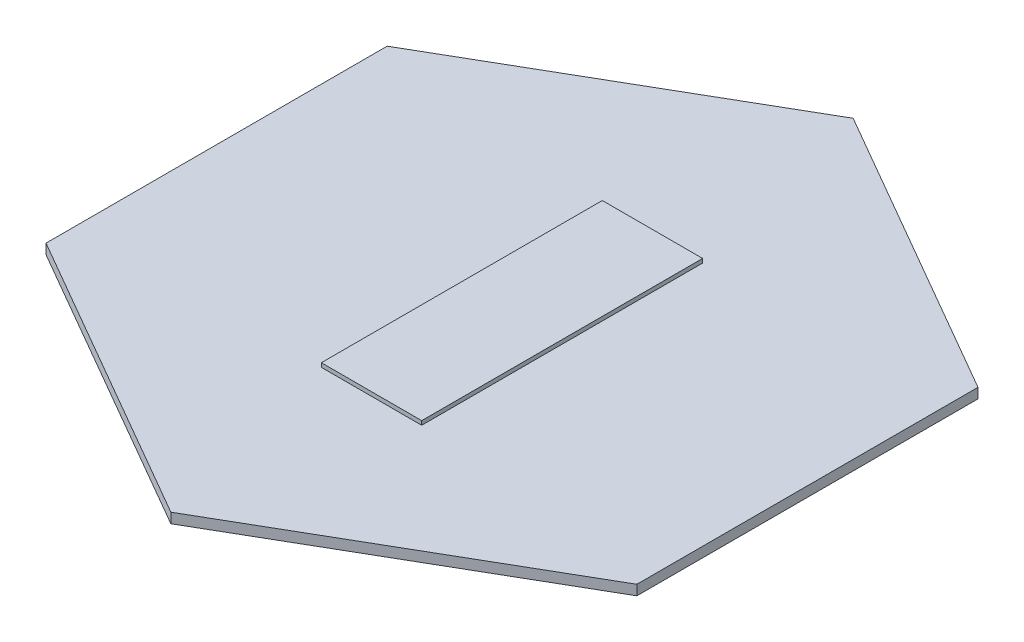
ISO-10303-21;
HEADER;
FILE_DESCRIPTION(('STEP AP214'),'2;1');
FILE_NAME('part.step','',(''),(''),'','','');
FILE_SCHEMA(('AUTOMOTIVE_DESIGN { 1 0 10303 214 1 1 1 1 }'));
ENDSEC;
DATA;
#1=APPLICATION_CONTEXT('core data for automotive mechanical design processes');
#2=APPLICATION_PROTOCOL_DEFINITION('international standard','automotive_design',2000,#1);
#3=PRODUCT_CONTEXT('',#1,'mechanical');
#4=PRODUCT('Part','Part','',(#3));
#5=PRODUCT_RELATED_PRODUCT_CATEGORY('part','',(#4));
#6=PRODUCT_DEFINITION_FORMATION('','',#4);
#7=PRODUCT_DEFINITION_CONTEXT('part definition',#1,'design');
#8=PRODUCT_DEFINITION('design','',#6,#7);
#9=PRODUCT_DEFINITION_SHAPE('','',#8);
#10=(LENGTH_UNIT() NAMED_UNIT(*) SI_UNIT(.MILLI.,.METRE.));
#11=(NAMED_UNIT(*) PLANE_ANGLE_UNIT() SI_UNIT($,.RADIAN.));
#12=(NAMED_UNIT(*) SI_UNIT($,.STERADIAN.) SOLID_ANGLE_UNIT());
#13=UNCERTAINTY_MEASURE_WITH_UNIT(LENGTH_MEASURE(1.E-05),#10,'distance_accuracy_value','');
#14=(GEOMETRIC_REPRESENTATION_CONTEXT(3) GLOBAL_UNCERTAINTY_ASSIGNED_CONTEXT((#13)) GLOBAL_UNIT_ASSIGNED_CONTEXT((#10,
#11,#12)) REPRESENTATION_CONTEXT('',''));
#15=CARTESIAN_POINT('',(0.,0.,0.));
#16=DIRECTION('',(0.,0.,1.));
#17=DIRECTION('',(1.,0.,0.));
#18=AXIS2_PLACEMENT_3D('',#15,#16,#17);
#19=CARTESIAN_POINT('',(0.,2.5,0.));
#20=DIRECTION('',(0.,1.,0.));
#21=DIRECTION('',(0.,0.,1.));
#22=AXIS2_PLACEMENT_3D('',#19,#20,#21);
#23=PLANE('',#22);
#24=DIRECTION('',(0.,0.,-1.));
#25=VECTOR('',#24,1.);
#26=CARTESIAN_POINT('',(73.6121593216773,2.5,42.5));
#27=LINE('',#26,#25);
#28=CARTESIAN_POINT('',(73.6121593216773,2.5,42.5));
#29=VERTEX_POINT('',#28);
#30=CARTESIAN_POINT('',(73.6121593216773,2.5,-42.5));
#31=VERTEX_POINT('',#30);
#32=EDGE_CURVE('E142',#29,#31,#27,.T.);
#33=ORIENTED_EDGE('',*,*,#32,.T.);
#34=DIRECTION('',(-0.866025403784439,0.,-0.5));
#35=VECTOR('',#34,1.);
#36=CARTESIAN_POINT('',(73.6121593216773,2.5,-42.5));
#37=LINE('',#36,#35);
#38=CARTESIAN_POINT('',(0.,2.5,-85.));
#39=VERTEX_POINT('',#38);
#40=EDGE_CURVE('E92',#31,#39,#37,.T.);
#41=ORIENTED_EDGE('',*,*,#40,.T.);
#42=DIRECTION('',(-0.866025403784438,0.,0.500000000000001));
#43=VECTOR('',#42,1.);
#44=CARTESIAN_POINT('',(0.,2.5,-85.));
#45=LINE('',#44,#43);
#46=CARTESIAN_POINT('',(-73.6121593216772,2.5,-42.5));
#47=VERTEX_POINT('',#46);
#48=EDGE_CURVE('E109',#39,#47,#45,.T.);
#49=ORIENTED_EDGE('',*,*,#48,.T.);
#50=DIRECTION('',(0.,0.,1.));
#51=VECTOR('',#50,1.);
#52=CARTESIAN_POINT('',(-73.6121593216772,2.5,-42.5));
#53=LINE('',#52,#51);
#54=CARTESIAN_POINT('',(-73.6121593216772,2.5,42.5));
#55=VERTEX_POINT('',#54);
#56=EDGE_CURVE('E102',#47,#55,#53,.T.);
#57=ORIENTED_EDGE('',*,*,#56,.T.);
#58=DIRECTION('',(0.866025403784439,0.,0.5));
#59=VECTOR('',#58,1.);
#60=CARTESIAN_POINT('',(-73.6121593216772,2.5,42.5));
#61=LINE('',#60,#59);
#62=CARTESIAN_POINT('',(0.,2.5,85.));
#63=VERTEX_POINT('',#62);
#64=EDGE_CURVE('E106',#55,#63,#61,.T.);
#65=ORIENTED_EDGE('',*,*,#64,.T.);
#66=DIRECTION('',(0.866025403784438,0.,-0.5));
#67=VECTOR('',#66,1.);
#68=CARTESIAN_POINT('',(0.,2.5,85.));
#69=LINE('',#68,#67);
#70=EDGE_CURVE('E57',#63,#29,#69,.T.);
#71=ORIENTED_EDGE('',*,*,#70,.T.);
#72=EDGE_LOOP('',(#33,#41,#49,#57,#65,#71));
#73=FACE_BOUND('',#72,.T.);
#74=DIRECTION('',(-1.,0.,0.));
#75=VECTOR('',#74,1.);
#76=CARTESIAN_POINT('',(-12.5,2.5,-35.));
#77=LINE('',#76,#75);
#78=CARTESIAN_POINT('',(12.5,2.5,-35.));
#79=VERTEX_POINT('',#78);
#80=CARTESIAN_POINT('',(-12.5,2.5,-35.));
#81=VERTEX_POINT('',#80);
#82=EDGE_CURVE('E174',#79,#81,#77,.T.);
#83=ORIENTED_EDGE('',*,*,#82,.F.);
#84=DIRECTION('',(0.,0.,-1.));
#85=VECTOR('',#84,1.);
#86=CARTESIAN_POINT('',(12.5,2.5,35.));
#87=LINE('',#86,#85);
#88=CARTESIAN_POINT('',(12.5,2.5,35.));
#89=VERTEX_POINT('',#88);
#90=EDGE_CURVE('E177',#89,#79,#87,.T.);
#91=ORIENTED_EDGE('',*,*,#90,.F.);
#92=DIRECTION('',(1.,0.,0.));
#93=VECTOR('',#92,1.);
#94=CARTESIAN_POINT('',(-12.5,2.5,35.));
#95=LINE('',#94,#93);
#96=CARTESIAN_POINT('',(-12.5,2.5,35.));
#97=VERTEX_POINT('',#96);
#98=EDGE_CURVE('E169',#97,#89,#95,.T.);
#99=ORIENTED_EDGE('',*,*,#98,.F.);
#100=DIRECTION('',(0.,0.,1.));
#101=VECTOR('',#100,1.);
#102=CARTESIAN_POINT('',(-12.5,2.5,35.));
#103=LINE('',#102,#101);
#104=EDGE_CURVE('E172',#81,#97,#103,.T.);
#105=ORIENTED_EDGE('',*,*,#104,.F.);
#106=EDGE_LOOP('',(#83,#91,#99,#105));
#107=FACE_BOUND('',#106,.T.);
#108=ADVANCED_FACE('F33',(#73,#107),#23,.T.);
#109=CARTESIAN_POINT('',(73.6121593216773,2.5,42.5));
#110=DIRECTION('',(-1.,0.,0.));
#111=DIRECTION('',(0.,0.,1.));
#112=AXIS2_PLACEMENT_3D('',#109,#110,#111);
#113=PLANE('',#112);
#114=DIRECTION('',(0.,0.,-1.));
#115=VECTOR('',#114,1.);
#116=CARTESIAN_POINT('',(73.6121593216773,0.,42.5));
#117=LINE('',#116,#115);
#118=CARTESIAN_POINT('',(73.6121593216773,0.,42.5));
#119=VERTEX_POINT('',#118);
#120=CARTESIAN_POINT('',(73.6121593216773,0.,-42.5));
#121=VERTEX_POINT('',#120);
#122=EDGE_CURVE('E130',#119,#121,#117,.T.);
#123=ORIENTED_EDGE('',*,*,#122,.T.);
#124=DIRECTION('',(0.,-1.,0.));
#125=VECTOR('',#124,1.);
#126=CARTESIAN_POINT('',(73.6121593216773,2.5,-42.5));
#127=LINE('',#126,#125);
#128=EDGE_CURVE('E11',#31,#121,#127,.T.);
#129=ORIENTED_EDGE('',*,*,#128,.F.);
#130=ORIENTED_EDGE('',*,*,#32,.F.);
#131=DIRECTION('',(0.,-1.,0.));
#132=VECTOR('',#131,1.);
#133=CARTESIAN_POINT('',(73.6121593216773,2.5,42.5));
#134=LINE('',#133,#132);
#135=EDGE_CURVE('E126',#29,#119,#134,.T.);
#136=ORIENTED_EDGE('',*,*,#135,.T.);
#137=EDGE_LOOP('',(#123,#129,#130,#136));
#138=FACE_BOUND('',#137,.T.);
#139=ADVANCED_FACE('F35',(#138),#113,.F.);
#140=CARTESIAN_POINT('',(73.6121593216773,2.5,-42.5));
#141=DIRECTION('',(-0.5,0.,0.866025403784439));
#142=DIRECTION('',(0.866025403784439,0.,0.5));
#143=AXIS2_PLACEMENT_3D('',#140,#141,#142);
#144=PLANE('',#143);
#145=DIRECTION('',(-0.866025403784439,0.,-0.5));
#146=VECTOR('',#145,1.);
#147=CARTESIAN_POINT('',(73.6121593216773,0.,-42.5));
#148=LINE('',#147,#146);
#149=CARTESIAN_POINT('',(0.,0.,-85.));
#150=VERTEX_POINT('',#149);
#151=EDGE_CURVE('E133',#121,#150,#148,.T.);
#152=ORIENTED_EDGE('',*,*,#151,.T.);
#153=DIRECTION('',(0.,-1.,0.));
#154=VECTOR('',#153,1.);
#155=CARTESIAN_POINT('',(0.,2.5,-85.));
#156=LINE('',#155,#154);
#157=EDGE_CURVE('E41',#39,#150,#156,.T.);
#158=ORIENTED_EDGE('',*,*,#157,.F.);
#159=ORIENTED_EDGE('',*,*,#40,.F.);
#160=ORIENTED_EDGE('',*,*,#128,.T.);
#161=EDGE_LOOP('',(#152,#158,#159,#160));
#162=FACE_BOUND('',#161,.T.);
#163=ADVANCED_FACE('F223',(#162),#144,.F.);
#164=CARTESIAN_POINT('',(0.,2.5,-85.));
#165=DIRECTION('',(0.500000000000001,0.,0.866025403784438));
#166=DIRECTION('',(0.866025403784438,0.,-0.500000000000001));
#167=AXIS2_PLACEMENT_3D('',#164,#165,#166);
#168=PLANE('',#167);
#169=DIRECTION('',(-0.866025403784438,0.,0.500000000000001));
#170=VECTOR('',#169,1.);
#171=CARTESIAN_POINT('',(0.,0.,-85.));
#172=LINE('',#171,#170);
#173=CARTESIAN_POINT('',(-73.6121593216772,0.,-42.5));
#174=VERTEX_POINT('',#173);
#175=EDGE_CURVE('E136',#150,#174,#172,.T.);
#176=ORIENTED_EDGE('',*,*,#175,.T.);
#177=DIRECTION('',(0.,-1.,0.));
#178=VECTOR('',#177,1.);
#179=CARTESIAN_POINT('',(-73.6121593216772,2.5,-42.5));
#180=LINE('',#179,#178);
#181=EDGE_CURVE('E121',#47,#174,#180,.T.);
#182=ORIENTED_EDGE('',*,*,#181,.F.);
#183=ORIENTED_EDGE('',*,*,#48,.F.);
#184=ORIENTED_EDGE('',*,*,#157,.T.);
#185=EDGE_LOOP('',(#176,#182,#183,#184));
#186=FACE_BOUND('',#185,.T.);
#187=ADVANCED_FACE('F148',(#186),#168,.F.);
#188=CARTESIAN_POINT('',(-73.6121593216772,2.5,-42.5));
#189=DIRECTION('',(1.,0.,0.));
#190=DIRECTION('',(0.,0.,-1.));
#191=AXIS2_PLACEMENT_3D('',#188,#189,#190);
#192=PLANE('',#191);
#193=DIRECTION('',(0.,0.,1.));
#194=VECTOR('',#193,1.);
#195=CARTESIAN_POINT('',(-73.6121593216772,0.,-42.5));
#196=LINE('',#195,#194);
#197=CARTESIAN_POINT('',(-73.6121593216772,0.,42.5));
#198=VERTEX_POINT('',#197);
#199=EDGE_CURVE('E118',#174,#198,#196,.T.);
#200=ORIENTED_EDGE('',*,*,#199,.T.);
#201=DIRECTION('',(0.,-1.,0.));
#202=VECTOR('',#201,1.);
#203=CARTESIAN_POINT('',(-73.6121593216772,2.5,42.5));
#204=LINE('',#203,#202);
#205=EDGE_CURVE('E115',#55,#198,#204,.T.);
#206=ORIENTED_EDGE('',*,*,#205,.F.);
#207=ORIENTED_EDGE('',*,*,#56,.F.);
#208=ORIENTED_EDGE('',*,*,#181,.T.);
#209=EDGE_LOOP('',(#200,#206,#207,#208));
#210=FACE_BOUND('',#209,.T.);
#211=ADVANCED_FACE('F116',(#210),#192,.F.);
#212=CARTESIAN_POINT('',(-73.6121593216772,2.5,42.5));
#213=DIRECTION('',(0.5,0.,-0.866025403784439));
#214=DIRECTION('',(-0.866025403784439,0.,-0.5));
#215=AXIS2_PLACEMENT_3D('',#212,#213,#214);
#216=PLANE('',#215);
#217=DIRECTION('',(0.866025403784439,0.,0.5));
#218=VECTOR('',#217,1.);
#219=CARTESIAN_POINT('',(-73.6121593216772,0.,42.5));
#220=LINE('',#219,#218);
#221=CARTESIAN_POINT('',(0.,0.,85.));
#222=VERTEX_POINT('',#221);
#223=EDGE_CURVE('E139',#198,#222,#220,.T.);
#224=ORIENTED_EDGE('',*,*,#223,.T.);
#225=DIRECTION('',(0.,-1.,0.));
#226=VECTOR('',#225,1.);
#227=CARTESIAN_POINT('',(0.,2.5,85.));
#228=LINE('',#227,#226);
#229=EDGE_CURVE('E122',#63,#222,#228,.T.);
#230=ORIENTED_EDGE('',*,*,#229,.F.);
#231=ORIENTED_EDGE('',*,*,#64,.F.);
#232=ORIENTED_EDGE('',*,*,#205,.T.);
#233=EDGE_LOOP('',(#224,#230,#231,#232));
#234=FACE_BOUND('',#233,.T.);
#235=ADVANCED_FACE('F124',(#234),#216,.F.);
#236=CARTESIAN_POINT('',(0.,2.5,85.));
#237=DIRECTION('',(-0.5,0.,-0.866025403784438));
#238=DIRECTION('',(-0.866025403784438,0.,0.5));
#239=AXIS2_PLACEMENT_3D('',#236,#237,#238);
#240=PLANE('',#239);
#241=DIRECTION('',(0.866025403784438,0.,-0.5));
#242=VECTOR('',#241,1.);
#243=CARTESIAN_POINT('',(0.,0.,85.));
#244=LINE('',#243,#242);
#245=EDGE_CURVE('E84',#222,#119,#244,.T.);
#246=ORIENTED_EDGE('',*,*,#245,.T.);
#247=ORIENTED_EDGE('',*,*,#135,.F.);
#248=ORIENTED_EDGE('',*,*,#70,.F.);
#249=ORIENTED_EDGE('',*,*,#229,.T.);
#250=EDGE_LOOP('',(#246,#247,#248,#249));
#251=FACE_BOUND('',#250,.T.);
#252=ADVANCED_FACE('F152',(#251),#240,.F.);
#253=CARTESIAN_POINT('',(0.,0.,0.));
#254=DIRECTION('',(0.,1.,0.));
#255=DIRECTION('',(0.,0.,1.));
#256=AXIS2_PLACEMENT_3D('',#253,#254,#255);
#257=PLANE('',#256);
#258=ORIENTED_EDGE('',*,*,#122,.F.);
#259=ORIENTED_EDGE('',*,*,#245,.F.);
#260=ORIENTED_EDGE('',*,*,#223,.F.);
#261=ORIENTED_EDGE('',*,*,#199,.F.);
#262=ORIENTED_EDGE('',*,*,#175,.F.);
#263=ORIENTED_EDGE('',*,*,#151,.F.);
#264=EDGE_LOOP('',(#258,#259,#260,#261,#262,#263));
#265=FACE_BOUND('',#264,.T.);
#266=ADVANCED_FACE('F151',(#265),#257,.F.);
#267=CARTESIAN_POINT('',(12.5,3.5,35.));
#268=DIRECTION('',(-1.,0.,0.));
#269=DIRECTION('',(0.,0.,1.));
#270=AXIS2_PLACEMENT_3D('',#267,#268,#269);
#271=PLANE('',#270);
#272=ORIENTED_EDGE('',*,*,#90,.T.);
#273=DIRECTION('',(0.,-1.,0.));
#274=VECTOR('',#273,1.);
#275=CARTESIAN_POINT('',(12.5,3.5,-35.));
#276=LINE('',#275,#274);
#277=CARTESIAN_POINT('',(12.5,3.5,-35.));
#278=VERTEX_POINT('',#277);
#279=EDGE_CURVE('E134',#278,#79,#276,.T.);
#280=ORIENTED_EDGE('',*,*,#279,.F.);
#281=DIRECTION('',(0.,0.,-1.));
#282=VECTOR('',#281,1.);
#283=CARTESIAN_POINT('',(12.5,3.5,35.));
#284=LINE('',#283,#282);
#285=CARTESIAN_POINT('',(12.5,3.5,35.));
#286=VERTEX_POINT('',#285);
#287=EDGE_CURVE('E171',#286,#278,#284,.T.);
#288=ORIENTED_EDGE('',*,*,#287,.F.);
#289=DIRECTION('',(0.,-1.,0.));
#290=VECTOR('',#289,1.);
#291=CARTESIAN_POINT('',(12.5,3.5,35.));
#292=LINE('',#291,#290);
#293=EDGE_CURVE('E165',#286,#89,#292,.T.);
#294=ORIENTED_EDGE('',*,*,#293,.T.);
#295=EDGE_LOOP('',(#272,#280,#288,#294));
#296=FACE_BOUND('',#295,.T.);
#297=ADVANCED_FACE('F200',(#296),#271,.F.);
#298=CARTESIAN_POINT('',(-12.5,3.5,-35.));
#299=DIRECTION('',(0.,0.,1.));
#300=DIRECTION('',(1.,0.,0.));
#301=AXIS2_PLACEMENT_3D('',#298,#299,#300);
#302=PLANE('',#301);
#303=ORIENTED_EDGE('',*,*,#82,.T.);
#304=DIRECTION('',(0.,-1.,0.));
#305=VECTOR('',#304,1.);
#306=CARTESIAN_POINT('',(-12.5,3.5,-35.));
#307=LINE('',#306,#305);
#308=CARTESIAN_POINT('',(-12.5,3.5,-35.));
#309=VERTEX_POINT('',#308);
#310=EDGE_CURVE('E161',#309,#81,#307,.T.);
#311=ORIENTED_EDGE('',*,*,#310,.F.);
#312=DIRECTION('',(-1.,0.,0.));
#313=VECTOR('',#312,1.);
#314=CARTESIAN_POINT('',(-12.5,3.5,-35.));
#315=LINE('',#314,#313);
#316=EDGE_CURVE('E185',#278,#309,#315,.T.);
#317=ORIENTED_EDGE('',*,*,#316,.F.);
#318=ORIENTED_EDGE('',*,*,#279,.T.);
#319=EDGE_LOOP('',(#303,#311,#317,#318));
#320=FACE_BOUND('',#319,.T.);
#321=ADVANCED_FACE('F205',(#320),#302,.F.);
#322=CARTESIAN_POINT('',(-12.5,3.5,35.));
#323=DIRECTION('',(1.,0.,0.));
#324=DIRECTION('',(0.,0.,-1.));
#325=AXIS2_PLACEMENT_3D('',#322,#323,#324);
#326=PLANE('',#325);
#327=ORIENTED_EDGE('',*,*,#104,.T.);
#328=DIRECTION('',(0.,-1.,0.));
#329=VECTOR('',#328,1.);
#330=CARTESIAN_POINT('',(-12.5,3.5,35.));
#331=LINE('',#330,#329);
#332=CARTESIAN_POINT('',(-12.5,3.5,35.));
#333=VERTEX_POINT('',#332);
#334=EDGE_CURVE('E48',#333,#97,#331,.T.);
#335=ORIENTED_EDGE('',*,*,#334,.F.);
#336=DIRECTION('',(0.,0.,1.));
#337=VECTOR('',#336,1.);
#338=CARTESIAN_POINT('',(-12.5,3.5,35.));
#339=LINE('',#338,#337);
#340=EDGE_CURVE('E182',#309,#333,#339,.T.);
#341=ORIENTED_EDGE('',*,*,#340,.F.);
#342=ORIENTED_EDGE('',*,*,#310,.T.);
#343=EDGE_LOOP('',(#327,#335,#341,#342));
#344=FACE_BOUND('',#343,.T.);
#345=ADVANCED_FACE('F214',(#344),#326,.F.);
#346=CARTESIAN_POINT('',(-12.5,3.5,35.));
#347=DIRECTION('',(0.,0.,-1.));
#348=DIRECTION('',(-1.,0.,0.));
#349=AXIS2_PLACEMENT_3D('',#346,#347,#348);
#350=PLANE('',#349);
#351=ORIENTED_EDGE('',*,*,#98,.T.);
#352=ORIENTED_EDGE('',*,*,#293,.F.);
#353=DIRECTION('',(1.,0.,0.));
#354=VECTOR('',#353,1.);
#355=CARTESIAN_POINT('',(-12.5,3.5,35.));
#356=LINE('',#355,#354);
#357=EDGE_CURVE('E168',#333,#286,#356,.T.);
#358=ORIENTED_EDGE('',*,*,#357,.F.);
#359=ORIENTED_EDGE('',*,*,#334,.T.);
#360=EDGE_LOOP('',(#351,#352,#358,#359));
#361=FACE_BOUND('',#360,.T.);
#362=ADVANCED_FACE('F217',(#361),#350,.F.);
#363=CARTESIAN_POINT('',(0.,3.5,0.));
#364=DIRECTION('',(0.,-1.,0.));
#365=DIRECTION('',(0.,0.,-1.));
#366=AXIS2_PLACEMENT_3D('',#363,#364,#365);
#367=PLANE('',#366);
#368=ORIENTED_EDGE('',*,*,#287,.T.);
#369=ORIENTED_EDGE('',*,*,#316,.T.);
#370=ORIENTED_EDGE('',*,*,#340,.T.);
#371=ORIENTED_EDGE('',*,*,#357,.T.);
#372=EDGE_LOOP('',(#368,#369,#370,#371));
#373=FACE_BOUND('',#372,.T.);
#374=ADVANCED_FACE('F193',(#373),#367,.F.);
#375=CLOSED_SHELL('',(#108,#139,#163,#187,#211,#235,#252,#266,#297,#321,#345,#362,#374));
#376=MANIFOLD_SOLID_BREP('B2',#375);
#377=ADVANCED_BREP_SHAPE_REPRESENTATION('',(#18,#376),#14);
#378=SHAPE_DEFINITION_REPRESENTATION(#9,#377);
ENDSEC;
END-ISO-10303-21;
